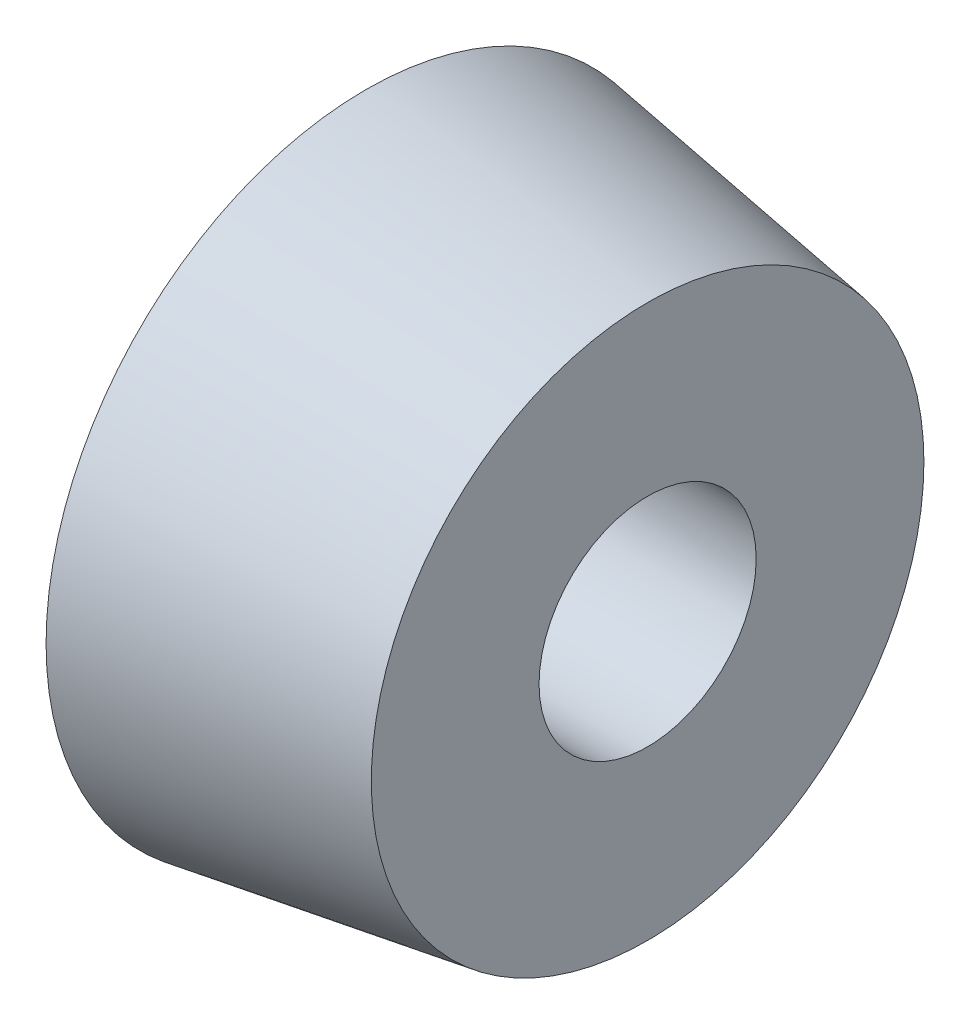
ISO-10303-21;
HEADER;
FILE_DESCRIPTION(('STEP AP214'),'2;1');
FILE_NAME('part.step','',(''),(''),'','','');
FILE_SCHEMA(('AUTOMOTIVE_DESIGN { 1 0 10303 214 1 1 1 1 }'));
ENDSEC;
DATA;
#1=APPLICATION_CONTEXT('core data for automotive mechanical design processes');
#2=APPLICATION_PROTOCOL_DEFINITION('international standard','automotive_design',2000,#1);
#3=PRODUCT_CONTEXT('',#1,'mechanical');
#4=PRODUCT('Part','Part','',(#3));
#5=PRODUCT_RELATED_PRODUCT_CATEGORY('part','',(#4));
#6=PRODUCT_DEFINITION_FORMATION('','',#4);
#7=PRODUCT_DEFINITION_CONTEXT('part definition',#1,'design');
#8=PRODUCT_DEFINITION('design','',#6,#7);
#9=PRODUCT_DEFINITION_SHAPE('','',#8);
#10=(LENGTH_UNIT() NAMED_UNIT(*) SI_UNIT(.MILLI.,.METRE.));
#11=(NAMED_UNIT(*) PLANE_ANGLE_UNIT() SI_UNIT($,.RADIAN.));
#12=(NAMED_UNIT(*) SI_UNIT($,.STERADIAN.) SOLID_ANGLE_UNIT());
#13=UNCERTAINTY_MEASURE_WITH_UNIT(LENGTH_MEASURE(1.E-05),#10,'distance_accuracy_value','');
#14=(GEOMETRIC_REPRESENTATION_CONTEXT(3) GLOBAL_UNCERTAINTY_ASSIGNED_CONTEXT((#13)) GLOBAL_UNIT_ASSIGNED_CONTEXT((#10,
#11,#12)) REPRESENTATION_CONTEXT('',''));
#15=CARTESIAN_POINT('',(0.,0.,0.));
#16=DIRECTION('',(0.,0.,1.));
#17=DIRECTION('',(1.,0.,0.));
#18=AXIS2_PLACEMENT_3D('',#15,#16,#17);
#19=CARTESIAN_POINT('',(929.772285353205,0.,-97.8305190412924));
#20=DIRECTION('',(-1.,0.,0.));
#21=DIRECTION('',(0.,0.,1.));
#22=AXIS2_PLACEMENT_3D('',#19,#20,#21);
#23=PLANE('',#22);
#24=CARTESIAN_POINT('',(929.772285353204,0.,-76.2));
#25=DIRECTION('',(1.,0.,0.));
#26=DIRECTION('',(0.,0.,-1.));
#27=AXIS2_PLACEMENT_3D('',#24,#25,#26);
#28=CIRCLE('',#27,21.6305190412923);
#29=CARTESIAN_POINT('',(929.772285353204,0.,-97.8305190412924));
#30=VERTEX_POINT('',#29);
#31=EDGE_CURVE('E43',#30,#30,#28,.T.);
#32=ORIENTED_EDGE('',*,*,#31,.F.);
#33=EDGE_LOOP('',(#32));
#34=FACE_BOUND('',#33,.T.);
#35=CARTESIAN_POINT('',(929.772285353205,0.,-76.2));
#36=DIRECTION('',(-1.,0.,0.));
#37=DIRECTION('',(0.,0.,1.));
#38=AXIS2_PLACEMENT_3D('',#35,#36,#37);
#39=CIRCLE('',#38,19.060352216467);
#40=CARTESIAN_POINT('',(929.772285353205,0.,-57.139647783533));
#41=VERTEX_POINT('',#40);
#42=EDGE_CURVE('E39',#41,#41,#39,.T.);
#43=ORIENTED_EDGE('',*,*,#42,.F.);
#44=EDGE_LOOP('',(#43));
#45=FACE_BOUND('',#44,.T.);
#46=ADVANCED_FACE('F35',(#34,#45),#23,.T.);
#47=CARTESIAN_POINT('',(929.772285353205,0.,-76.2));
#48=DIRECTION('',(-1.,0.,0.));
#49=DIRECTION('',(0.,0.,1.));
#50=AXIS2_PLACEMENT_3D('',#47,#48,#49);
#51=CIRCLE('',#50,7.34187);
#52=CARTESIAN_POINT('',(929.772285353205,0.,-68.85813));
#53=VERTEX_POINT('',#52);
#54=EDGE_CURVE('E57',#53,#53,#51,.T.);
#55=ORIENTED_EDGE('',*,*,#54,.F.);
#56=EDGE_LOOP('',(#55));
#57=FACE_BOUND('',#56,.T.);
#58=CARTESIAN_POINT('',(929.772285353205,0.,-76.2));
#59=DIRECTION('',(-1.,0.,0.));
#60=DIRECTION('',(0.,0.,1.));
#61=AXIS2_PLACEMENT_3D('',#58,#59,#60);
#62=CIRCLE('',#61,9.88187);
#63=CARTESIAN_POINT('',(929.772285353205,0.,-66.31813));
#64=VERTEX_POINT('',#63);
#65=EDGE_CURVE('E51',#64,#64,#62,.F.);
#66=ORIENTED_EDGE('',*,*,#65,.F.);
#67=EDGE_LOOP('',(#66));
#68=FACE_BOUND('',#67,.T.);
#69=ADVANCED_FACE('F81',(#57,#68),#23,.T.);
#70=CARTESIAN_POINT('',(948.822285353206,0.,-76.2));
#71=DIRECTION('',(-1.,0.,0.));
#72=DIRECTION('',(0.,0.,1.));
#73=AXIS2_PLACEMENT_3D('',#70,#71,#72);
#74=CONICAL_SURFACE('',#73,18.6858017725102,0.153364501021489);
#75=ORIENTED_EDGE('',*,*,#31,.T.);
#76=EDGE_LOOP('',(#75));
#77=FACE_BOUND('',#76,.T.);
#78=CARTESIAN_POINT('',(948.822285353206,0.,-76.2));
#79=DIRECTION('',(1.,0.,0.));
#80=DIRECTION('',(0.,0.,-1.));
#81=AXIS2_PLACEMENT_3D('',#78,#79,#80);
#82=CIRCLE('',#81,18.6858017725102);
#83=CARTESIAN_POINT('',(948.822285353206,0.,-94.8858017725102));
#84=VERTEX_POINT('',#83);
#85=EDGE_CURVE('E10',#84,#84,#82,.T.);
#86=ORIENTED_EDGE('',*,*,#85,.F.);
#87=EDGE_LOOP('',(#86));
#88=FACE_BOUND('',#87,.T.);
#89=ADVANCED_FACE('F37',(#77,#88),#74,.T.);
#90=CARTESIAN_POINT('',(948.822285353206,0.,-94.8858017725102));
#91=DIRECTION('',(1.,0.,0.));
#92=DIRECTION('',(0.,0.,-1.));
#93=AXIS2_PLACEMENT_3D('',#90,#91,#92);
#94=PLANE('',#93);
#95=CARTESIAN_POINT('',(948.822285353206,0.,-76.2));
#96=DIRECTION('',(-1.,0.,0.));
#97=DIRECTION('',(0.,0.,1.));
#98=AXIS2_PLACEMENT_3D('',#95,#96,#97);
#99=CIRCLE('',#98,7.34186999999999);
#100=CARTESIAN_POINT('',(948.822285353206,0.,-68.85813));
#101=VERTEX_POINT('',#100);
#102=EDGE_CURVE('E48',#101,#101,#99,.T.);
#103=ORIENTED_EDGE('',*,*,#102,.T.);
#104=EDGE_LOOP('',(#103));
#105=FACE_BOUND('',#104,.T.);
#106=ORIENTED_EDGE('',*,*,#85,.T.);
#107=EDGE_LOOP('',(#106));
#108=FACE_BOUND('',#107,.T.);
#109=ADVANCED_FACE('F72',(#105,#108),#94,.T.);
#110=CARTESIAN_POINT('',(929.772285353205,0.,-76.2));
#111=DIRECTION('',(-1.,0.,0.));
#112=DIRECTION('',(0.,0.,1.));
#113=AXIS2_PLACEMENT_3D('',#110,#111,#112);
#114=CYLINDRICAL_SURFACE('',#113,7.34186999999999);
#115=ORIENTED_EDGE('',*,*,#102,.F.);
#116=EDGE_LOOP('',(#115));
#117=FACE_BOUND('',#116,.T.);
#118=ORIENTED_EDGE('',*,*,#54,.T.);
#119=EDGE_LOOP('',(#118));
#120=FACE_BOUND('',#119,.T.);
#121=ADVANCED_FACE('F74',(#117,#120),#114,.F.);
#122=CARTESIAN_POINT('',(943.592311058571,0.,-76.2));
#123=DIRECTION('',(-1.,0.,0.));
#124=DIRECTION('',(0.,0.,1.));
#125=AXIS2_PLACEMENT_3D('',#122,#123,#124);
#126=CONICAL_SURFACE('',#125,16.9240756626822,0.153364501021488);
#127=ORIENTED_EDGE('',*,*,#42,.T.);
#128=EDGE_LOOP('',(#127));
#129=FACE_BOUND('',#128,.T.);
#130=CARTESIAN_POINT('',(943.592311058571,0.,-76.2));
#131=DIRECTION('',(1.,0.,0.));
#132=DIRECTION('',(0.,0.,-1.));
#133=AXIS2_PLACEMENT_3D('',#130,#131,#132);
#134=CIRCLE('',#133,16.9240756626822);
#135=CARTESIAN_POINT('',(943.592311058571,0.,-93.1240756626822));
#136=VERTEX_POINT('',#135);
#137=EDGE_CURVE('E53',#136,#136,#134,.T.);
#138=ORIENTED_EDGE('',*,*,#137,.T.);
#139=EDGE_LOOP('',(#138));
#140=FACE_BOUND('',#139,.T.);
#141=ADVANCED_FACE('F77',(#129,#140),#126,.F.);
#142=CARTESIAN_POINT('',(943.107285353206,0.,-76.2));
#143=DIRECTION('',(1.,0.,0.));
#144=DIRECTION('',(0.,0.,-1.));
#145=AXIS2_PLACEMENT_3D('',#142,#143,#144);
#146=TOROIDAL_SURFACE('',#145,13.786341597288,3.17500000000003);
#147=ORIENTED_EDGE('',*,*,#137,.F.);
#148=EDGE_LOOP('',(#147));
#149=FACE_BOUND('',#148,.T.);
#150=CARTESIAN_POINT('',(946.282285353206,0.,-76.2));
#151=DIRECTION('',(1.,0.,0.));
#152=DIRECTION('',(0.,0.,-1.));
#153=AXIS2_PLACEMENT_3D('',#150,#151,#152);
#154=CIRCLE('',#153,13.786341597288);
#155=CARTESIAN_POINT('',(946.282285353206,0.,-89.986341597288));
#156=VERTEX_POINT('',#155);
#157=EDGE_CURVE('E59',#156,#156,#154,.T.);
#158=ORIENTED_EDGE('',*,*,#157,.T.);
#159=EDGE_LOOP('',(#158));
#160=FACE_BOUND('',#159,.T.);
#161=ADVANCED_FACE('F107',(#149,#160),#146,.F.);
#162=CARTESIAN_POINT('',(946.282285353206,0.,-89.986341597288));
#163=DIRECTION('',(1.,0.,0.));
#164=DIRECTION('',(0.,0.,-1.));
#165=AXIS2_PLACEMENT_3D('',#162,#163,#164);
#166=PLANE('',#165);
#167=ORIENTED_EDGE('',*,*,#157,.F.);
#168=EDGE_LOOP('',(#167));
#169=FACE_BOUND('',#168,.T.);
#170=CARTESIAN_POINT('',(946.282285353206,0.,-76.2));
#171=DIRECTION('',(1.,0.,0.));
#172=DIRECTION('',(0.,0.,-1.));
#173=AXIS2_PLACEMENT_3D('',#170,#171,#172);
#174=CIRCLE('',#173,13.05687);
#175=CARTESIAN_POINT('',(946.282285353206,0.,-89.25687));
#176=VERTEX_POINT('',#175);
#177=EDGE_CURVE('E64',#176,#176,#174,.T.);
#178=ORIENTED_EDGE('',*,*,#177,.T.);
#179=EDGE_LOOP('',(#178));
#180=FACE_BOUND('',#179,.T.);
#181=ADVANCED_FACE('F114',(#169,#180),#166,.F.);
#182=CARTESIAN_POINT('',(943.107285353206,0.,-76.2));
#183=DIRECTION('',(1.,0.,0.));
#184=DIRECTION('',(0.,0.,-1.));
#185=AXIS2_PLACEMENT_3D('',#182,#183,#184);
#186=TOROIDAL_SURFACE('',#185,13.05687,3.17500000000002);
#187=ORIENTED_EDGE('',*,*,#177,.F.);
#188=EDGE_LOOP('',(#187));
#189=FACE_BOUND('',#188,.T.);
#190=CARTESIAN_POINT('',(943.107285353206,0.,-76.2));
#191=DIRECTION('',(1.,0.,0.));
#192=DIRECTION('',(0.,0.,-1.));
#193=AXIS2_PLACEMENT_3D('',#190,#191,#192);
#194=CIRCLE('',#193,9.88187);
#195=CARTESIAN_POINT('',(943.107285353206,0.,-86.08187));
#196=VERTEX_POINT('',#195);
#197=EDGE_CURVE('E173',#196,#196,#194,.T.);
#198=ORIENTED_EDGE('',*,*,#197,.T.);
#199=EDGE_LOOP('',(#198));
#200=FACE_BOUND('',#199,.T.);
#201=ADVANCED_FACE('F122',(#189,#200),#186,.F.);
#202=CARTESIAN_POINT('',(1049.72112859509,0.,-76.2));
#203=DIRECTION('',(1.,0.,0.));
#204=DIRECTION('',(0.,0.,-1.));
#205=AXIS2_PLACEMENT_3D('',#202,#203,#204);
#206=CYLINDRICAL_SURFACE('',#205,9.88187);
#207=ORIENTED_EDGE('',*,*,#65,.T.);
#208=EDGE_LOOP('',(#207));
#209=FACE_BOUND('',#208,.T.);
#210=ORIENTED_EDGE('',*,*,#197,.F.);
#211=EDGE_LOOP('',(#210));
#212=FACE_BOUND('',#211,.T.);
#213=ADVANCED_FACE('F130',(#209,#212),#206,.T.);
#214=CLOSED_SHELL('',(#46,#69,#89,#109,#121,#141,#161,#181,#201,#213));
#215=MANIFOLD_SOLID_BREP('B2',#214);
#216=ADVANCED_BREP_SHAPE_REPRESENTATION('',(#18,#215),#14);
#217=SHAPE_DEFINITION_REPRESENTATION(#9,#216);
ENDSEC;
END-ISO-10303-21;
